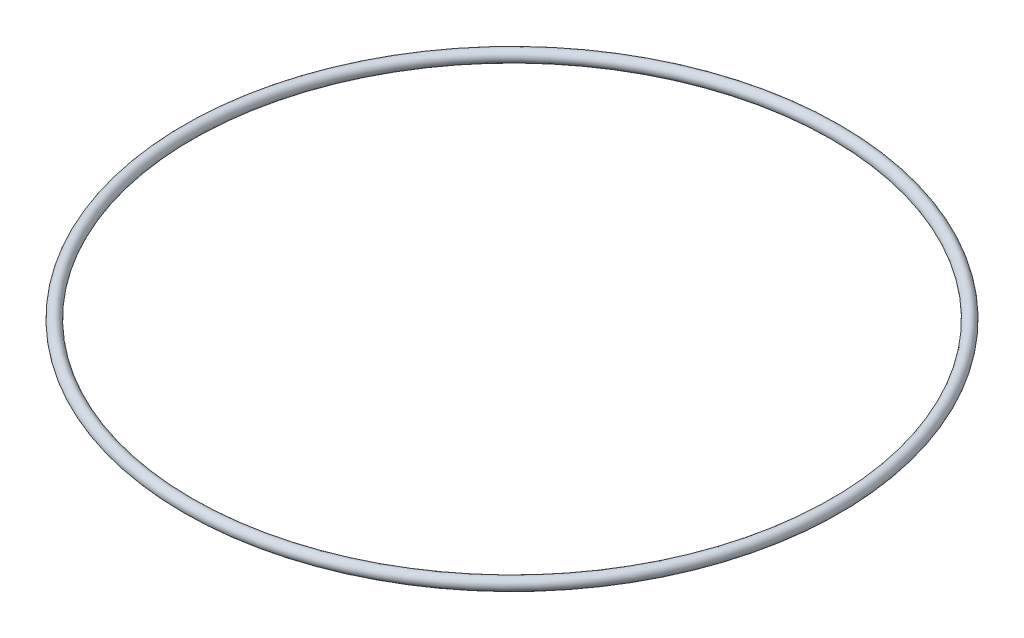
ISO-10303-21;
HEADER;
FILE_DESCRIPTION(('STEP AP214'),'2;1');
FILE_NAME('part.step','',(''),(''),'','','');
FILE_SCHEMA(('AUTOMOTIVE_DESIGN { 1 0 10303 214 1 1 1 1 }'));
ENDSEC;
DATA;
#1=APPLICATION_CONTEXT('core data for automotive mechanical design processes');
#2=APPLICATION_PROTOCOL_DEFINITION('international standard','automotive_design',2000,#1);
#3=PRODUCT_CONTEXT('',#1,'mechanical');
#4=PRODUCT('Part','Part','',(#3));
#5=PRODUCT_RELATED_PRODUCT_CATEGORY('part','',(#4));
#6=PRODUCT_DEFINITION_FORMATION('','',#4);
#7=PRODUCT_DEFINITION_CONTEXT('part definition',#1,'design');
#8=PRODUCT_DEFINITION('design','',#6,#7);
#9=PRODUCT_DEFINITION_SHAPE('','',#8);
#10=(LENGTH_UNIT() NAMED_UNIT(*) SI_UNIT(.MILLI.,.METRE.));
#11=(NAMED_UNIT(*) PLANE_ANGLE_UNIT() SI_UNIT($,.RADIAN.));
#12=(NAMED_UNIT(*) SI_UNIT($,.STERADIAN.) SOLID_ANGLE_UNIT());
#13=UNCERTAINTY_MEASURE_WITH_UNIT(LENGTH_MEASURE(1.E-05),#10,'distance_accuracy_value','');
#14=(GEOMETRIC_REPRESENTATION_CONTEXT(3) GLOBAL_UNCERTAINTY_ASSIGNED_CONTEXT((#13)) GLOBAL_UNIT_ASSIGNED_CONTEXT((#10,
#11,#12)) REPRESENTATION_CONTEXT('',''));
#15=CARTESIAN_POINT('',(0.,0.,0.));
#16=DIRECTION('',(0.,0.,1.));
#17=DIRECTION('',(1.,0.,0.));
#18=AXIS2_PLACEMENT_3D('',#15,#16,#17);
#19=CARTESIAN_POINT('',(0.,0.,0.));
#20=DIRECTION('',(0.,1.,0.));
#21=DIRECTION('',(0.,0.,1.));
#22=AXIS2_PLACEMENT_3D('',#19,#20,#21);
#23=TOROIDAL_SURFACE('',#22,27.94,0.508000000000002);
#24=CARTESIAN_POINT('',(0.,0.,27.94));
#25=DIRECTION('',(1.,0.,0.));
#26=DIRECTION('',(0.,0.,-1.));
#27=AXIS2_PLACEMENT_3D('',#24,#25,#26);
#28=CIRCLE('',#27,0.508000000000002);
#29=CARTESIAN_POINT('',(0.,0.,28.448));
#30=VERTEX_POINT('',#29);
#31=EDGE_CURVE('E11',#30,#30,#28,.T.);
#32=CARTESIAN_POINT('',(0.,0.,0.));
#33=DIRECTION('',(0.,1.,0.));
#34=DIRECTION('',(0.,0.,1.));
#35=AXIS2_PLACEMENT_3D('',#32,#33,#34);
#36=CIRCLE('',#35,28.448);
#37=EDGE_CURVE('',#30,#30,#36,.T.);
#38=ORIENTED_EDGE('',*,*,#31,.T.);
#39=ORIENTED_EDGE('',*,*,#31,.F.);
#40=ORIENTED_EDGE('',*,*,#37,.T.);
#41=ORIENTED_EDGE('',*,*,#37,.F.);
#42=EDGE_LOOP('',(#38,#40,#39,#41));
#43=FACE_BOUND('',#42,.T.);
#44=ADVANCED_FACE('F55',(#43),#23,.T.);
#45=CLOSED_SHELL('',(#44));
#46=MANIFOLD_SOLID_BREP('B2',#45);
#47=ADVANCED_BREP_SHAPE_REPRESENTATION('',(#18,#46),#14);
#48=SHAPE_DEFINITION_REPRESENTATION(#9,#47);
ENDSEC;
END-ISO-10303-21;
